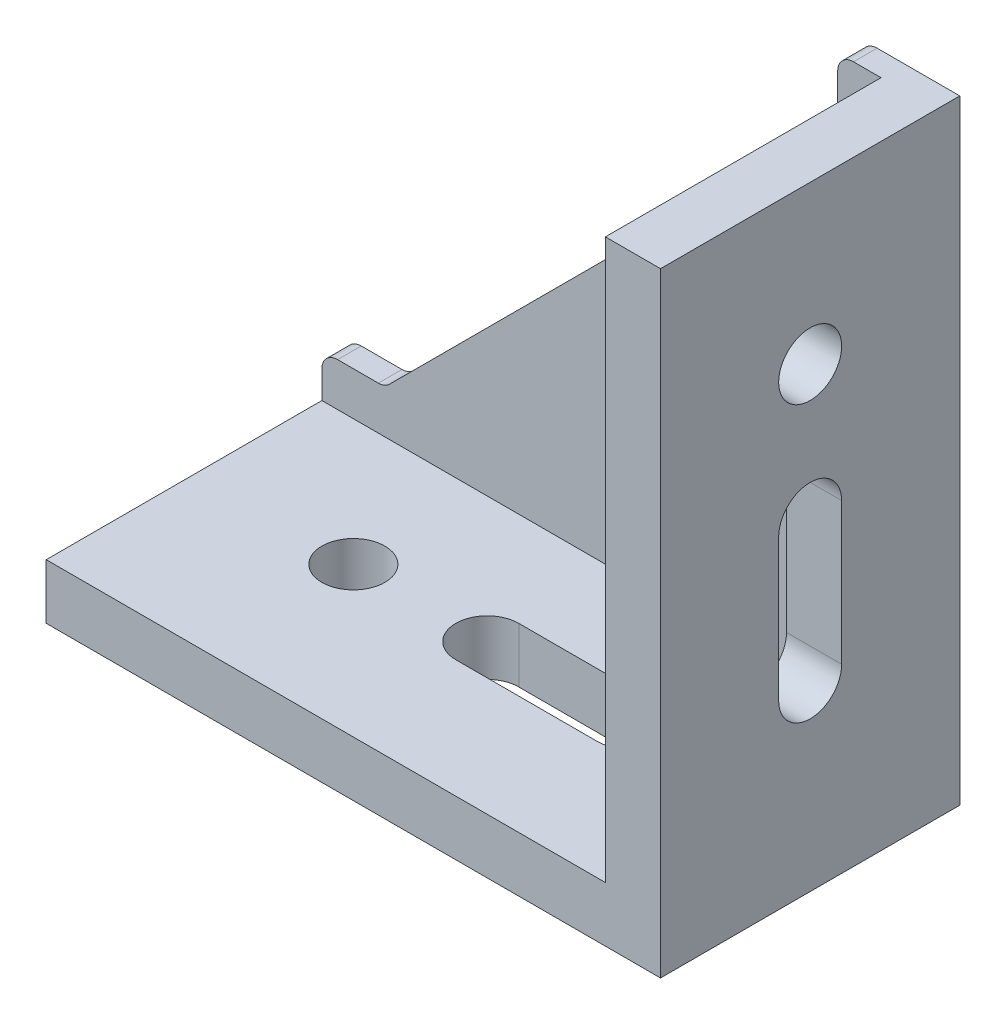
ISO-10303-21;
HEADER;
FILE_DESCRIPTION(('STEP AP214'),'2;1');
FILE_NAME('part.step','',(''),(''),'','','');
FILE_SCHEMA(('AUTOMOTIVE_DESIGN { 1 0 10303 214 1 1 1 1 }'));
ENDSEC;
DATA;
#1=APPLICATION_CONTEXT('core data for automotive mechanical design processes');
#2=APPLICATION_PROTOCOL_DEFINITION('international standard','automotive_design',2000,#1);
#3=PRODUCT_CONTEXT('',#1,'mechanical');
#4=PRODUCT('Part','Part','',(#3));
#5=PRODUCT_RELATED_PRODUCT_CATEGORY('part','',(#4));
#6=PRODUCT_DEFINITION_FORMATION('','',#4);
#7=PRODUCT_DEFINITION_CONTEXT('part definition',#1,'design');
#8=PRODUCT_DEFINITION('design','',#6,#7);
#9=PRODUCT_DEFINITION_SHAPE('','',#8);
#10=(LENGTH_UNIT() NAMED_UNIT(*) SI_UNIT(.MILLI.,.METRE.));
#11=(NAMED_UNIT(*) PLANE_ANGLE_UNIT() SI_UNIT($,.RADIAN.));
#12=(NAMED_UNIT(*) SI_UNIT($,.STERADIAN.) SOLID_ANGLE_UNIT());
#13=UNCERTAINTY_MEASURE_WITH_UNIT(LENGTH_MEASURE(1.E-05),#10,'distance_accuracy_value','');
#14=(GEOMETRIC_REPRESENTATION_CONTEXT(3) GLOBAL_UNCERTAINTY_ASSIGNED_CONTEXT((#13)) GLOBAL_UNIT_ASSIGNED_CONTEXT((#10,
#11,#12)) REPRESENTATION_CONTEXT('',''));
#15=CARTESIAN_POINT('',(0.,0.,0.));
#16=DIRECTION('',(0.,0.,1.));
#17=DIRECTION('',(1.,0.,0.));
#18=AXIS2_PLACEMENT_3D('',#15,#16,#17);
#19=CARTESIAN_POINT('',(0.,0.,35.));
#20=DIRECTION('',(1.,0.,0.));
#21=DIRECTION('',(0.,0.,-1.));
#22=AXIS2_PLACEMENT_3D('',#19,#20,#21);
#23=PLANE('',#22);
#24=DIRECTION('',(0.,1.,0.));
#25=VECTOR('',#24,1.);
#26=CARTESIAN_POINT('',(0.,12.5,0.));
#27=LINE('',#26,#25);
#28=CARTESIAN_POINT('',(0.,7.,0.));
#29=VERTEX_POINT('',#28);
#30=CARTESIAN_POINT('',(0.,10.5,0.));
#31=VERTEX_POINT('',#30);
#32=EDGE_CURVE('E292',#29,#31,#27,.T.);
#33=ORIENTED_EDGE('',*,*,#32,.T.);
#34=DIRECTION('',(0.,0.,1.));
#35=VECTOR('',#34,1.);
#36=CARTESIAN_POINT('',(0.,10.5,35.));
#37=LINE('',#36,#35);
#38=CARTESIAN_POINT('',(0.,10.5,-3.));
#39=VERTEX_POINT('',#38);
#40=EDGE_CURVE('E344',#31,#39,#37,.F.);
#41=ORIENTED_EDGE('',*,*,#40,.T.);
#42=DIRECTION('',(0.,1.,0.));
#43=VECTOR('',#42,1.);
#44=CARTESIAN_POINT('',(0.,12.5,-3.));
#45=LINE('',#44,#43);
#46=CARTESIAN_POINT('',(0.,0.,-3.));
#47=VERTEX_POINT('',#46);
#48=EDGE_CURVE('E280',#47,#39,#45,.T.);
#49=ORIENTED_EDGE('',*,*,#48,.F.);
#50=DIRECTION('',(0.,0.,-1.));
#51=VECTOR('',#50,1.);
#52=CARTESIAN_POINT('',(0.,0.,35.));
#53=LINE('',#52,#51);
#54=CARTESIAN_POINT('',(0.,0.,35.));
#55=VERTEX_POINT('',#54);
#56=EDGE_CURVE('E334',#55,#47,#53,.T.);
#57=ORIENTED_EDGE('',*,*,#56,.F.);
#58=DIRECTION('',(0.,-1.,0.));
#59=VECTOR('',#58,1.);
#60=CARTESIAN_POINT('',(0.,0.,35.));
#61=LINE('',#60,#59);
#62=CARTESIAN_POINT('',(0.,7.,35.));
#63=VERTEX_POINT('',#62);
#64=EDGE_CURVE('E302',#63,#55,#61,.T.);
#65=ORIENTED_EDGE('',*,*,#64,.F.);
#66=DIRECTION('',(0.,0.,-1.));
#67=VECTOR('',#66,1.);
#68=CARTESIAN_POINT('',(0.,7.,35.));
#69=LINE('',#68,#67);
#70=EDGE_CURVE('E316',#63,#29,#69,.T.);
#71=ORIENTED_EDGE('',*,*,#70,.T.);
#72=EDGE_LOOP('',(#33,#41,#49,#57,#65,#71));
#73=FACE_BOUND('',#72,.T.);
#74=ADVANCED_FACE('F37',(#73),#23,.F.);
#75=CARTESIAN_POINT('',(0.,0.,35.));
#76=DIRECTION('',(0.,1.,0.));
#77=DIRECTION('',(0.,0.,1.));
#78=AXIS2_PLACEMENT_3D('',#75,#76,#77);
#79=PLANE('',#78);
#80=CARTESIAN_POINT('',(20.,0.,16.));
#81=DIRECTION('',(0.,1.,0.));
#82=DIRECTION('',(0.,0.,1.));
#83=AXIS2_PLACEMENT_3D('',#80,#81,#82);
#84=CIRCLE('',#83,4.00000000000001);
#85=CARTESIAN_POINT('',(20.,0.,20.));
#86=VERTEX_POINT('',#85);
#87=EDGE_CURVE('E270',#86,#86,#84,.T.);
#88=ORIENTED_EDGE('',*,*,#87,.T.);
#89=EDGE_LOOP('',(#88));
#90=FACE_BOUND('',#89,.T.);
#91=DIRECTION('',(-1.,0.,0.));
#92=VECTOR('',#91,1.);
#93=CARTESIAN_POINT('',(37.,0.,12.));
#94=LINE('',#93,#92);
#95=CARTESIAN_POINT('',(55.,0.,12.));
#96=VERTEX_POINT('',#95);
#97=CARTESIAN_POINT('',(37.,0.,12.));
#98=VERTEX_POINT('',#97);
#99=EDGE_CURVE('E197',#96,#98,#94,.T.);
#100=ORIENTED_EDGE('',*,*,#99,.T.);
#101=CARTESIAN_POINT('',(37.,0.,16.));
#102=DIRECTION('',(0.,1.,0.));
#103=DIRECTION('',(0.,0.,1.));
#104=AXIS2_PLACEMENT_3D('',#101,#102,#103);
#105=CIRCLE('',#104,4.);
#106=CARTESIAN_POINT('',(37.,0.,20.));
#107=VERTEX_POINT('',#106);
#108=EDGE_CURVE('E189',#98,#107,#105,.T.);
#109=ORIENTED_EDGE('',*,*,#108,.T.);
#110=DIRECTION('',(1.,0.,0.));
#111=VECTOR('',#110,1.);
#112=CARTESIAN_POINT('',(37.,0.,20.));
#113=LINE('',#112,#111);
#114=CARTESIAN_POINT('',(55.,0.,20.));
#115=VERTEX_POINT('',#114);
#116=EDGE_CURVE('E201',#107,#115,#113,.T.);
#117=ORIENTED_EDGE('',*,*,#116,.T.);
#118=CARTESIAN_POINT('',(55.,0.,16.));
#119=DIRECTION('',(0.,1.,0.));
#120=DIRECTION('',(0.,0.,1.));
#121=AXIS2_PLACEMENT_3D('',#118,#119,#120);
#122=CIRCLE('',#121,4.);
#123=EDGE_CURVE('E205',#115,#96,#122,.T.);
#124=ORIENTED_EDGE('',*,*,#123,.T.);
#125=EDGE_LOOP('',(#100,#109,#117,#124));
#126=FACE_BOUND('',#125,.T.);
#127=ORIENTED_EDGE('',*,*,#56,.T.);
#128=DIRECTION('',(-1.,0.,0.));
#129=VECTOR('',#128,1.);
#130=CARTESIAN_POINT('',(78.,0.,-3.));
#131=LINE('',#130,#129);
#132=CARTESIAN_POINT('',(78.,0.,-3.));
#133=VERTEX_POINT('',#132);
#134=EDGE_CURVE('E277',#133,#47,#131,.T.);
#135=ORIENTED_EDGE('',*,*,#134,.F.);
#136=DIRECTION('',(0.,0.,-1.));
#137=VECTOR('',#136,1.);
#138=CARTESIAN_POINT('',(78.,0.,35.));
#139=LINE('',#138,#137);
#140=CARTESIAN_POINT('',(78.,0.,35.));
#141=VERTEX_POINT('',#140);
#142=EDGE_CURVE('E332',#141,#133,#139,.T.);
#143=ORIENTED_EDGE('',*,*,#142,.F.);
#144=DIRECTION('',(1.,0.,0.));
#145=VECTOR('',#144,1.);
#146=CARTESIAN_POINT('',(0.,0.,35.));
#147=LINE('',#146,#145);
#148=EDGE_CURVE('E305',#55,#141,#147,.T.);
#149=ORIENTED_EDGE('',*,*,#148,.F.);
#150=EDGE_LOOP('',(#127,#135,#143,#149));
#151=FACE_BOUND('',#150,.T.);
#152=ADVANCED_FACE('F207',(#90,#126,#151),#79,.F.);
#153=CARTESIAN_POINT('',(78.,0.,35.));
#154=DIRECTION('',(-1.,0.,0.));
#155=DIRECTION('',(0.,0.,1.));
#156=AXIS2_PLACEMENT_3D('',#153,#154,#155);
#157=PLANE('',#156);
#158=DIRECTION('',(0.,1.,0.));
#159=VECTOR('',#158,1.);
#160=CARTESIAN_POINT('',(78.,41.,20.));
#161=LINE('',#160,#159);
#162=CARTESIAN_POINT('',(78.,23.,20.));
#163=VERTEX_POINT('',#162);
#164=CARTESIAN_POINT('',(78.,41.,20.));
#165=VERTEX_POINT('',#164);
#166=EDGE_CURVE('E241',#163,#165,#161,.T.);
#167=ORIENTED_EDGE('',*,*,#166,.T.);
#168=CARTESIAN_POINT('',(78.,41.,16.));
#169=DIRECTION('',(-1.,0.,0.));
#170=DIRECTION('',(0.,0.,1.));
#171=AXIS2_PLACEMENT_3D('',#168,#169,#170);
#172=CIRCLE('',#171,4.);
#173=CARTESIAN_POINT('',(78.,41.,12.));
#174=VERTEX_POINT('',#173);
#175=EDGE_CURVE('E231',#165,#174,#172,.T.);
#176=ORIENTED_EDGE('',*,*,#175,.T.);
#177=DIRECTION('',(0.,-1.,0.));
#178=VECTOR('',#177,1.);
#179=CARTESIAN_POINT('',(78.,41.,12.));
#180=LINE('',#179,#178);
#181=CARTESIAN_POINT('',(78.,23.,12.));
#182=VERTEX_POINT('',#181);
#183=EDGE_CURVE('E234',#174,#182,#180,.T.);
#184=ORIENTED_EDGE('',*,*,#183,.T.);
#185=CARTESIAN_POINT('',(78.,23.,16.));
#186=DIRECTION('',(-1.,0.,0.));
#187=DIRECTION('',(0.,0.,1.));
#188=AXIS2_PLACEMENT_3D('',#185,#186,#187);
#189=CIRCLE('',#188,4.);
#190=EDGE_CURVE('E238',#182,#163,#189,.T.);
#191=ORIENTED_EDGE('',*,*,#190,.T.);
#192=EDGE_LOOP('',(#167,#176,#184,#191));
#193=FACE_BOUND('',#192,.T.);
#194=CARTESIAN_POINT('',(78.,58.,16.));
#195=DIRECTION('',(-1.,0.,0.));
#196=DIRECTION('',(0.,0.,1.));
#197=AXIS2_PLACEMENT_3D('',#194,#195,#196);
#198=CIRCLE('',#197,4.);
#199=CARTESIAN_POINT('',(78.,58.,20.));
#200=VERTEX_POINT('',#199);
#201=EDGE_CURVE('E248',#200,#200,#198,.T.);
#202=ORIENTED_EDGE('',*,*,#201,.T.);
#203=EDGE_LOOP('',(#202));
#204=FACE_BOUND('',#203,.T.);
#205=ORIENTED_EDGE('',*,*,#142,.T.);
#206=DIRECTION('',(0.,-1.,0.));
#207=VECTOR('',#206,1.);
#208=CARTESIAN_POINT('',(78.,78.,-3.));
#209=LINE('',#208,#207);
#210=CARTESIAN_POINT('',(78.,78.,-3.));
#211=VERTEX_POINT('',#210);
#212=EDGE_CURVE('E273',#211,#133,#209,.T.);
#213=ORIENTED_EDGE('',*,*,#212,.F.);
#214=DIRECTION('',(0.,0.,-1.));
#215=VECTOR('',#214,1.);
#216=CARTESIAN_POINT('',(78.,78.,35.));
#217=LINE('',#216,#215);
#218=CARTESIAN_POINT('',(78.,78.,35.));
#219=VERTEX_POINT('',#218);
#220=EDGE_CURVE('E329',#219,#211,#217,.T.);
#221=ORIENTED_EDGE('',*,*,#220,.F.);
#222=DIRECTION('',(0.,1.,0.));
#223=VECTOR('',#222,1.);
#224=CARTESIAN_POINT('',(78.,0.,35.));
#225=LINE('',#224,#223);
#226=EDGE_CURVE('E308',#141,#219,#225,.T.);
#227=ORIENTED_EDGE('',*,*,#226,.F.);
#228=EDGE_LOOP('',(#205,#213,#221,#227));
#229=FACE_BOUND('',#228,.T.);
#230=ADVANCED_FACE('F405',(#193,#204,#229),#157,.F.);
#231=CARTESIAN_POINT('',(71.,78.,35.));
#232=DIRECTION('',(0.,-1.,0.));
#233=DIRECTION('',(0.,0.,-1.));
#234=AXIS2_PLACEMENT_3D('',#231,#232,#233);
#235=PLANE('',#234);
#236=DIRECTION('',(1.,0.,0.));
#237=VECTOR('',#236,1.);
#238=CARTESIAN_POINT('',(78.,78.,-3.));
#239=LINE('',#238,#237);
#240=CARTESIAN_POINT('',(67.5,78.,-3.));
#241=VERTEX_POINT('',#240);
#242=EDGE_CURVE('E271',#241,#211,#239,.T.);
#243=ORIENTED_EDGE('',*,*,#242,.F.);
#244=DIRECTION('',(0.,0.,1.));
#245=VECTOR('',#244,1.);
#246=CARTESIAN_POINT('',(67.5,78.,35.));
#247=LINE('',#246,#245);
#248=CARTESIAN_POINT('',(67.5,78.,0.));
#249=VERTEX_POINT('',#248);
#250=EDGE_CURVE('E350',#241,#249,#247,.T.);
#251=ORIENTED_EDGE('',*,*,#250,.T.);
#252=DIRECTION('',(1.,0.,0.));
#253=VECTOR('',#252,1.);
#254=CARTESIAN_POINT('',(78.,78.,0.));
#255=LINE('',#254,#253);
#256=CARTESIAN_POINT('',(71.,78.,0.));
#257=VERTEX_POINT('',#256);
#258=EDGE_CURVE('E258',#249,#257,#255,.T.);
#259=ORIENTED_EDGE('',*,*,#258,.T.);
#260=DIRECTION('',(0.,0.,-1.));
#261=VECTOR('',#260,1.);
#262=CARTESIAN_POINT('',(71.,78.,35.));
#263=LINE('',#262,#261);
#264=CARTESIAN_POINT('',(71.,78.,35.));
#265=VERTEX_POINT('',#264);
#266=EDGE_CURVE('E326',#265,#257,#263,.T.);
#267=ORIENTED_EDGE('',*,*,#266,.F.);
#268=DIRECTION('',(-1.,0.,0.));
#269=VECTOR('',#268,1.);
#270=CARTESIAN_POINT('',(71.,78.,35.));
#271=LINE('',#270,#269);
#272=EDGE_CURVE('E310',#219,#265,#271,.T.);
#273=ORIENTED_EDGE('',*,*,#272,.F.);
#274=ORIENTED_EDGE('',*,*,#220,.T.);
#275=EDGE_LOOP('',(#243,#251,#259,#267,#273,#274));
#276=FACE_BOUND('',#275,.T.);
#277=ADVANCED_FACE('F386',(#276),#235,.F.);
#278=CARTESIAN_POINT('',(71.,7.,35.));
#279=DIRECTION('',(1.,0.,0.));
#280=DIRECTION('',(0.,0.,-1.));
#281=AXIS2_PLACEMENT_3D('',#278,#279,#280);
#282=PLANE('',#281);
#283=DIRECTION('',(0.,-1.,0.));
#284=VECTOR('',#283,1.);
#285=CARTESIAN_POINT('',(71.,41.,12.));
#286=LINE('',#285,#284);
#287=CARTESIAN_POINT('',(71.,41.,12.));
#288=VERTEX_POINT('',#287);
#289=CARTESIAN_POINT('',(71.,23.,12.));
#290=VERTEX_POINT('',#289);
#291=EDGE_CURVE('E247',#288,#290,#286,.T.);
#292=ORIENTED_EDGE('',*,*,#291,.F.);
#293=CARTESIAN_POINT('',(71.,41.,16.));
#294=DIRECTION('',(-1.,0.,0.));
#295=DIRECTION('',(0.,0.,1.));
#296=AXIS2_PLACEMENT_3D('',#293,#294,#295);
#297=CIRCLE('',#296,4.);
#298=CARTESIAN_POINT('',(71.,41.,20.));
#299=VERTEX_POINT('',#298);
#300=EDGE_CURVE('E245',#299,#288,#297,.T.);
#301=ORIENTED_EDGE('',*,*,#300,.F.);
#302=DIRECTION('',(0.,1.,0.));
#303=VECTOR('',#302,1.);
#304=CARTESIAN_POINT('',(71.,41.,20.));
#305=LINE('',#304,#303);
#306=CARTESIAN_POINT('',(71.,23.,20.));
#307=VERTEX_POINT('',#306);
#308=EDGE_CURVE('E235',#307,#299,#305,.T.);
#309=ORIENTED_EDGE('',*,*,#308,.F.);
#310=CARTESIAN_POINT('',(71.,23.,16.));
#311=DIRECTION('',(-1.,0.,0.));
#312=DIRECTION('',(0.,0.,1.));
#313=AXIS2_PLACEMENT_3D('',#310,#311,#312);
#314=CIRCLE('',#313,4.);
#315=EDGE_CURVE('E251',#290,#307,#314,.T.);
#316=ORIENTED_EDGE('',*,*,#315,.F.);
#317=EDGE_LOOP('',(#292,#301,#309,#316));
#318=FACE_BOUND('',#317,.T.);
#319=CARTESIAN_POINT('',(71.,58.,16.));
#320=DIRECTION('',(-1.,0.,0.));
#321=DIRECTION('',(0.,0.,1.));
#322=AXIS2_PLACEMENT_3D('',#319,#320,#321);
#323=CIRCLE('',#322,4.);
#324=CARTESIAN_POINT('',(71.,58.,20.));
#325=VERTEX_POINT('',#324);
#326=EDGE_CURVE('E267',#325,#325,#323,.T.);
#327=ORIENTED_EDGE('',*,*,#326,.F.);
#328=EDGE_LOOP('',(#327));
#329=FACE_BOUND('',#328,.T.);
#330=DIRECTION('',(0.,-1.,0.));
#331=VECTOR('',#330,1.);
#332=CARTESIAN_POINT('',(71.,7.,0.));
#333=LINE('',#332,#331);
#334=CARTESIAN_POINT('',(71.,7.,0.));
#335=VERTEX_POINT('',#334);
#336=EDGE_CURVE('E290',#257,#335,#333,.T.);
#337=ORIENTED_EDGE('',*,*,#336,.T.);
#338=DIRECTION('',(0.,0.,-1.));
#339=VECTOR('',#338,1.);
#340=CARTESIAN_POINT('',(71.,7.,35.));
#341=LINE('',#340,#339);
#342=CARTESIAN_POINT('',(71.,7.,35.));
#343=VERTEX_POINT('',#342);
#344=EDGE_CURVE('E323',#343,#335,#341,.T.);
#345=ORIENTED_EDGE('',*,*,#344,.F.);
#346=DIRECTION('',(0.,-1.,0.));
#347=VECTOR('',#346,1.);
#348=CARTESIAN_POINT('',(71.,7.,35.));
#349=LINE('',#348,#347);
#350=EDGE_CURVE('E312',#265,#343,#349,.T.);
#351=ORIENTED_EDGE('',*,*,#350,.F.);
#352=ORIENTED_EDGE('',*,*,#266,.T.);
#353=EDGE_LOOP('',(#337,#345,#351,#352));
#354=FACE_BOUND('',#353,.T.);
#355=ADVANCED_FACE('F397',(#318,#329,#354),#282,.F.);
#356=CARTESIAN_POINT('',(0.,7.,35.));
#357=DIRECTION('',(0.,-1.,0.));
#358=DIRECTION('',(0.,0.,-1.));
#359=AXIS2_PLACEMENT_3D('',#356,#357,#358);
#360=PLANE('',#359);
#361=CARTESIAN_POINT('',(20.,7.,16.));
#362=DIRECTION('',(0.,1.,0.));
#363=DIRECTION('',(0.,0.,1.));
#364=AXIS2_PLACEMENT_3D('',#361,#362,#363);
#365=CIRCLE('',#364,4.00000000000001);
#366=CARTESIAN_POINT('',(20.,7.,20.));
#367=VERTEX_POINT('',#366);
#368=EDGE_CURVE('E216',#367,#367,#365,.T.);
#369=ORIENTED_EDGE('',*,*,#368,.F.);
#370=EDGE_LOOP('',(#369));
#371=FACE_BOUND('',#370,.T.);
#372=DIRECTION('',(1.,0.,0.));
#373=VECTOR('',#372,1.);
#374=CARTESIAN_POINT('',(37.,7.,20.));
#375=LINE('',#374,#373);
#376=CARTESIAN_POINT('',(37.,7.,20.));
#377=VERTEX_POINT('',#376);
#378=CARTESIAN_POINT('',(55.,7.,20.));
#379=VERTEX_POINT('',#378);
#380=EDGE_CURVE('E222',#377,#379,#375,.T.);
#381=ORIENTED_EDGE('',*,*,#380,.F.);
#382=CARTESIAN_POINT('',(37.,7.,16.));
#383=DIRECTION('',(0.,1.,0.));
#384=DIRECTION('',(0.,0.,1.));
#385=AXIS2_PLACEMENT_3D('',#382,#383,#384);
#386=CIRCLE('',#385,4.);
#387=CARTESIAN_POINT('',(37.,7.,12.));
#388=VERTEX_POINT('',#387);
#389=EDGE_CURVE('E192',#388,#377,#386,.T.);
#390=ORIENTED_EDGE('',*,*,#389,.F.);
#391=DIRECTION('',(-1.,0.,0.));
#392=VECTOR('',#391,1.);
#393=CARTESIAN_POINT('',(37.,7.,12.));
#394=LINE('',#393,#392);
#395=CARTESIAN_POINT('',(55.,7.,12.));
#396=VERTEX_POINT('',#395);
#397=EDGE_CURVE('E210',#396,#388,#394,.T.);
#398=ORIENTED_EDGE('',*,*,#397,.F.);
#399=CARTESIAN_POINT('',(55.,7.,16.));
#400=DIRECTION('',(0.,1.,0.));
#401=DIRECTION('',(0.,0.,1.));
#402=AXIS2_PLACEMENT_3D('',#399,#400,#401);
#403=CIRCLE('',#402,4.);
#404=EDGE_CURVE('E213',#379,#396,#403,.T.);
#405=ORIENTED_EDGE('',*,*,#404,.F.);
#406=EDGE_LOOP('',(#381,#390,#398,#405));
#407=FACE_BOUND('',#406,.T.);
#408=DIRECTION('',(-1.,0.,0.));
#409=VECTOR('',#408,1.);
#410=CARTESIAN_POINT('',(0.,7.,0.));
#411=LINE('',#410,#409);
#412=EDGE_CURVE('E306',#335,#29,#411,.T.);
#413=ORIENTED_EDGE('',*,*,#412,.T.);
#414=ORIENTED_EDGE('',*,*,#70,.F.);
#415=DIRECTION('',(-1.,0.,0.));
#416=VECTOR('',#415,1.);
#417=CARTESIAN_POINT('',(0.,7.,35.));
#418=LINE('',#417,#416);
#419=EDGE_CURVE('E314',#343,#63,#418,.T.);
#420=ORIENTED_EDGE('',*,*,#419,.F.);
#421=ORIENTED_EDGE('',*,*,#344,.T.);
#422=EDGE_LOOP('',(#413,#414,#420,#421));
#423=FACE_BOUND('',#422,.T.);
#424=ADVANCED_FACE('F494',(#371,#407,#423),#360,.F.);
#425=CARTESIAN_POINT('',(0.,0.,35.));
#426=DIRECTION('',(0.,0.,-1.));
#427=DIRECTION('',(-1.,0.,0.));
#428=AXIS2_PLACEMENT_3D('',#425,#426,#427);
#429=PLANE('',#428);
#430=ORIENTED_EDGE('',*,*,#64,.T.);
#431=ORIENTED_EDGE('',*,*,#148,.T.);
#432=ORIENTED_EDGE('',*,*,#226,.T.);
#433=ORIENTED_EDGE('',*,*,#272,.T.);
#434=ORIENTED_EDGE('',*,*,#350,.T.);
#435=ORIENTED_EDGE('',*,*,#419,.T.);
#436=EDGE_LOOP('',(#430,#431,#432,#433,#434,#435));
#437=FACE_BOUND('',#436,.T.);
#438=ADVANCED_FACE('F400',(#437),#429,.F.);
#439=CARTESIAN_POINT('',(0.,0.,0.));
#440=DIRECTION('',(0.,0.,1.));
#441=DIRECTION('',(1.,0.,0.));
#442=AXIS2_PLACEMENT_3D('',#439,#440,#441);
#443=PLANE('',#442);
#444=DIRECTION('',(1.,0.,0.));
#445=VECTOR('',#444,1.);
#446=CARTESIAN_POINT('',(8.,12.5,0.));
#447=LINE('',#446,#445);
#448=CARTESIAN_POINT('',(2.,12.5,0.));
#449=VERTEX_POINT('',#448);
#450=CARTESIAN_POINT('',(7.17157287525382,12.5,0.));
#451=VERTEX_POINT('',#450);
#452=EDGE_CURVE('E295',#449,#451,#447,.T.);
#453=ORIENTED_EDGE('',*,*,#452,.F.);
#454=CARTESIAN_POINT('',(2.,10.5,0.));
#455=DIRECTION('',(0.,0.,1.));
#456=DIRECTION('',(1.,0.,0.));
#457=AXIS2_PLACEMENT_3D('',#454,#455,#456);
#458=CIRCLE('',#457,2.);
#459=EDGE_CURVE('E342',#449,#31,#458,.T.);
#460=ORIENTED_EDGE('',*,*,#459,.T.);
#461=ORIENTED_EDGE('',*,*,#32,.F.);
#462=ORIENTED_EDGE('',*,*,#412,.F.);
#463=ORIENTED_EDGE('',*,*,#336,.F.);
#464=ORIENTED_EDGE('',*,*,#258,.F.);
#465=CARTESIAN_POINT('',(67.5,76.,0.));
#466=DIRECTION('',(0.,0.,1.));
#467=DIRECTION('',(1.,0.,0.));
#468=AXIS2_PLACEMENT_3D('',#465,#466,#467);
#469=CIRCLE('',#468,2.);
#470=CARTESIAN_POINT('',(65.5,76.,0.));
#471=VERTEX_POINT('',#470);
#472=EDGE_CURVE('E339',#249,#471,#469,.T.);
#473=ORIENTED_EDGE('',*,*,#472,.T.);
#474=DIRECTION('',(0.,1.,0.));
#475=VECTOR('',#474,1.);
#476=CARTESIAN_POINT('',(65.5,78.,0.));
#477=LINE('',#476,#475);
#478=CARTESIAN_POINT('',(65.5,70.8284271247462,0.));
#479=VERTEX_POINT('',#478);
#480=EDGE_CURVE('E274',#479,#471,#477,.T.);
#481=ORIENTED_EDGE('',*,*,#480,.F.);
#482=CARTESIAN_POINT('',(63.5,70.8284271247462,0.));
#483=DIRECTION('',(0.,0.,1.));
#484=DIRECTION('',(1.,0.,0.));
#485=AXIS2_PLACEMENT_3D('',#482,#483,#484);
#486=CIRCLE('',#485,2.);
#487=CARTESIAN_POINT('',(64.9142135623731,69.4142135623731,0.));
#488=VERTEX_POINT('',#487);
#489=EDGE_CURVE('E45',#479,#488,#486,.F.);
#490=ORIENTED_EDGE('',*,*,#489,.T.);
#491=DIRECTION('',(0.707106781186548,0.707106781186548,0.));
#492=VECTOR('',#491,1.);
#493=CARTESIAN_POINT('',(65.5,70.,0.));
#494=LINE('',#493,#492);
#495=CARTESIAN_POINT('',(8.5857864376269,13.0857864376269,0.));
#496=VERTEX_POINT('',#495);
#497=EDGE_CURVE('E298',#496,#488,#494,.T.);
#498=ORIENTED_EDGE('',*,*,#497,.F.);
#499=CARTESIAN_POINT('',(7.17157287525382,14.5,0.));
#500=DIRECTION('',(0.,0.,1.));
#501=DIRECTION('',(1.,0.,0.));
#502=AXIS2_PLACEMENT_3D('',#499,#500,#501);
#503=CIRCLE('',#502,2.);
#504=EDGE_CURVE('E365',#496,#451,#503,.F.);
#505=ORIENTED_EDGE('',*,*,#504,.T.);
#506=EDGE_LOOP('',(#453,#460,#461,#462,#463,#464,#473,#481,#490,#498,#505));
#507=FACE_BOUND('',#506,.T.);
#508=ADVANCED_FACE('F372',(#507),#443,.T.);
#509=CARTESIAN_POINT('',(8.,12.5,-3.));
#510=DIRECTION('',(0.,-1.,0.));
#511=DIRECTION('',(0.,0.,-1.));
#512=AXIS2_PLACEMENT_3D('',#509,#510,#511);
#513=PLANE('',#512);
#514=ORIENTED_EDGE('',*,*,#452,.T.);
#515=DIRECTION('',(0.,0.,1.));
#516=VECTOR('',#515,1.);
#517=CARTESIAN_POINT('',(7.17157287525382,12.5,-3.));
#518=LINE('',#517,#516);
#519=CARTESIAN_POINT('',(7.17157287525382,12.5,-3.));
#520=VERTEX_POINT('',#519);
#521=EDGE_CURVE('E361',#451,#520,#518,.F.);
#522=ORIENTED_EDGE('',*,*,#521,.T.);
#523=DIRECTION('',(1.,0.,0.));
#524=VECTOR('',#523,1.);
#525=CARTESIAN_POINT('',(8.,12.5,-3.));
#526=LINE('',#525,#524);
#527=CARTESIAN_POINT('',(2.,12.5,-3.));
#528=VERTEX_POINT('',#527);
#529=EDGE_CURVE('E283',#528,#520,#526,.T.);
#530=ORIENTED_EDGE('',*,*,#529,.F.);
#531=DIRECTION('',(0.,0.,1.));
#532=VECTOR('',#531,1.);
#533=CARTESIAN_POINT('',(2.,12.5,-3.));
#534=LINE('',#533,#532);
#535=EDGE_CURVE('E336',#528,#449,#534,.T.);
#536=ORIENTED_EDGE('',*,*,#535,.T.);
#537=EDGE_LOOP('',(#514,#522,#530,#536));
#538=FACE_BOUND('',#537,.T.);
#539=ADVANCED_FACE('F418',(#538),#513,.F.);
#540=CARTESIAN_POINT('',(65.5,70.,-3.));
#541=DIRECTION('',(0.707106781186548,-0.707106781186547,0.));
#542=DIRECTION('',(0.707106781186547,0.707106781186548,0.));
#543=AXIS2_PLACEMENT_3D('',#540,#541,#542);
#544=PLANE('',#543);
#545=DIRECTION('',(0.707106781186548,0.707106781186548,0.));
#546=VECTOR('',#545,1.);
#547=CARTESIAN_POINT('',(65.5,70.,-3.));
#548=LINE('',#547,#546);
#549=CARTESIAN_POINT('',(8.5857864376269,13.0857864376269,-3.));
#550=VERTEX_POINT('',#549);
#551=CARTESIAN_POINT('',(64.9142135623731,69.4142135623731,-3.));
#552=VERTEX_POINT('',#551);
#553=EDGE_CURVE('E286',#550,#552,#548,.T.);
#554=ORIENTED_EDGE('',*,*,#553,.F.);
#555=DIRECTION('',(0.,0.,1.));
#556=VECTOR('',#555,1.);
#557=CARTESIAN_POINT('',(8.58578643762691,13.0857864376269,0.));
#558=LINE('',#557,#556);
#559=EDGE_CURVE('E358',#550,#496,#558,.T.);
#560=ORIENTED_EDGE('',*,*,#559,.T.);
#561=ORIENTED_EDGE('',*,*,#497,.T.);
#562=DIRECTION('',(0.,0.,1.));
#563=VECTOR('',#562,1.);
#564=CARTESIAN_POINT('',(64.9142135623731,69.4142135623731,-3.));
#565=LINE('',#564,#563);
#566=EDGE_CURVE('E356',#488,#552,#565,.F.);
#567=ORIENTED_EDGE('',*,*,#566,.T.);
#568=EDGE_LOOP('',(#554,#560,#561,#567));
#569=FACE_BOUND('',#568,.T.);
#570=ADVANCED_FACE('F375',(#569),#544,.F.);
#571=CARTESIAN_POINT('',(65.5,78.,-3.));
#572=DIRECTION('',(1.,0.,0.));
#573=DIRECTION('',(0.,0.,-1.));
#574=AXIS2_PLACEMENT_3D('',#571,#572,#573);
#575=PLANE('',#574);
#576=DIRECTION('',(0.,1.,0.));
#577=VECTOR('',#576,1.);
#578=CARTESIAN_POINT('',(65.5,78.,-3.));
#579=LINE('',#578,#577);
#580=CARTESIAN_POINT('',(65.5,70.8284271247462,-3.));
#581=VERTEX_POINT('',#580);
#582=CARTESIAN_POINT('',(65.5,76.,-3.));
#583=VERTEX_POINT('',#582);
#584=EDGE_CURVE('E288',#581,#583,#579,.T.);
#585=ORIENTED_EDGE('',*,*,#584,.F.);
#586=DIRECTION('',(0.,0.,1.));
#587=VECTOR('',#586,1.);
#588=CARTESIAN_POINT('',(65.5,70.8284271247462,0.));
#589=LINE('',#588,#587);
#590=EDGE_CURVE('E363',#581,#479,#589,.T.);
#591=ORIENTED_EDGE('',*,*,#590,.T.);
#592=ORIENTED_EDGE('',*,*,#480,.T.);
#593=DIRECTION('',(0.,0.,1.));
#594=VECTOR('',#593,1.);
#595=CARTESIAN_POINT('',(65.5,76.,-3.));
#596=LINE('',#595,#594);
#597=EDGE_CURVE('E353',#471,#583,#596,.F.);
#598=ORIENTED_EDGE('',*,*,#597,.T.);
#599=EDGE_LOOP('',(#585,#591,#592,#598));
#600=FACE_BOUND('',#599,.T.);
#601=ADVANCED_FACE('F378',(#600),#575,.F.);
#602=CARTESIAN_POINT('',(0.,0.,-3.));
#603=DIRECTION('',(0.,0.,1.));
#604=DIRECTION('',(1.,0.,0.));
#605=AXIS2_PLACEMENT_3D('',#602,#603,#604);
#606=PLANE('',#605);
#607=ORIENTED_EDGE('',*,*,#48,.T.);
#608=CARTESIAN_POINT('',(2.,10.5,-3.));
#609=DIRECTION('',(0.,0.,1.));
#610=DIRECTION('',(1.,0.,0.));
#611=AXIS2_PLACEMENT_3D('',#608,#609,#610);
#612=CIRCLE('',#611,2.);
#613=EDGE_CURVE('E348',#39,#528,#612,.F.);
#614=ORIENTED_EDGE('',*,*,#613,.T.);
#615=ORIENTED_EDGE('',*,*,#529,.T.);
#616=CARTESIAN_POINT('',(7.17157287525382,14.5,-3.));
#617=DIRECTION('',(0.,0.,1.));
#618=DIRECTION('',(1.,0.,0.));
#619=AXIS2_PLACEMENT_3D('',#616,#617,#618);
#620=CIRCLE('',#619,2.);
#621=EDGE_CURVE('E367',#520,#550,#620,.T.);
#622=ORIENTED_EDGE('',*,*,#621,.T.);
#623=ORIENTED_EDGE('',*,*,#553,.T.);
#624=CARTESIAN_POINT('',(63.5,70.8284271247462,-3.));
#625=DIRECTION('',(0.,0.,1.));
#626=DIRECTION('',(1.,0.,0.));
#627=AXIS2_PLACEMENT_3D('',#624,#625,#626);
#628=CIRCLE('',#627,2.);
#629=EDGE_CURVE('E11',#552,#581,#628,.T.);
#630=ORIENTED_EDGE('',*,*,#629,.T.);
#631=ORIENTED_EDGE('',*,*,#584,.T.);
#632=CARTESIAN_POINT('',(67.5,76.,-3.));
#633=DIRECTION('',(0.,0.,1.));
#634=DIRECTION('',(1.,0.,0.));
#635=AXIS2_PLACEMENT_3D('',#632,#633,#634);
#636=CIRCLE('',#635,2.);
#637=EDGE_CURVE('E346',#583,#241,#636,.F.);
#638=ORIENTED_EDGE('',*,*,#637,.T.);
#639=ORIENTED_EDGE('',*,*,#242,.T.);
#640=ORIENTED_EDGE('',*,*,#212,.T.);
#641=ORIENTED_EDGE('',*,*,#134,.T.);
#642=EDGE_LOOP('',(#607,#614,#615,#622,#623,#630,#631,#638,#639,#640,#641));
#643=FACE_BOUND('',#642,.T.);
#644=ADVANCED_FACE('F381',(#643),#606,.F.);
#645=CARTESIAN_POINT('',(78.,58.,16.));
#646=DIRECTION('',(-1.,0.,0.));
#647=DIRECTION('',(0.,0.,1.));
#648=AXIS2_PLACEMENT_3D('',#645,#646,#647);
#649=CYLINDRICAL_SURFACE('',#648,4.);
#650=CARTESIAN_POINT('',(78.,58.,20.));
#651=CARTESIAN_POINT('',(77.9270833333333,58.,20.));
#652=CARTESIAN_POINT('',(77.8541666666667,58.,20.));
#653=CARTESIAN_POINT('',(77.7083333333333,58.,20.));
#654=CARTESIAN_POINT('',(77.6354166666667,58.,20.));
#655=CARTESIAN_POINT('',(77.4895833333333,58.,20.));
#656=CARTESIAN_POINT('',(77.4166666666667,58.,20.));
#657=CARTESIAN_POINT('',(77.2708333333333,58.,20.));
#658=CARTESIAN_POINT('',(77.1979166666667,58.,20.));
#659=CARTESIAN_POINT('',(77.0520833333333,58.,20.));
#660=CARTESIAN_POINT('',(76.9791666666667,58.,20.));
#661=CARTESIAN_POINT('',(76.8333333333333,58.,20.));
#662=CARTESIAN_POINT('',(76.7604166666667,58.,20.));
#663=CARTESIAN_POINT('',(76.6145833333333,58.,20.));
#664=CARTESIAN_POINT('',(76.5416666666667,58.,20.));
#665=CARTESIAN_POINT('',(76.3958333333333,58.,20.));
#666=CARTESIAN_POINT('',(76.3229166666667,58.,20.));
#667=CARTESIAN_POINT('',(76.1770833333333,58.,20.));
#668=CARTESIAN_POINT('',(76.1041666666667,58.,20.));
#669=CARTESIAN_POINT('',(75.9583333333333,58.,20.));
#670=CARTESIAN_POINT('',(75.8854166666667,58.,20.));
#671=CARTESIAN_POINT('',(75.7395833333333,58.,20.));
#672=CARTESIAN_POINT('',(75.6666666666667,58.,20.));
#673=CARTESIAN_POINT('',(75.5208333333333,58.,20.));
#674=CARTESIAN_POINT('',(75.4479166666667,58.,20.));
#675=CARTESIAN_POINT('',(75.3020833333333,58.,20.));
#676=CARTESIAN_POINT('',(75.2291666666667,58.,20.));
#677=CARTESIAN_POINT('',(75.0833333333333,58.,20.));
#678=CARTESIAN_POINT('',(75.0104166666667,58.,20.));
#679=CARTESIAN_POINT('',(74.8645833333333,58.,20.));
#680=CARTESIAN_POINT('',(74.7916666666667,58.,20.));
#681=CARTESIAN_POINT('',(74.6458333333333,58.,20.));
#682=CARTESIAN_POINT('',(74.5729166666667,58.,20.));
#683=CARTESIAN_POINT('',(74.4270833333333,58.,20.));
#684=CARTESIAN_POINT('',(74.3541666666667,58.,20.));
#685=CARTESIAN_POINT('',(74.2083333333333,58.,20.));
#686=CARTESIAN_POINT('',(74.1354166666667,58.,20.));
#687=CARTESIAN_POINT('',(73.9895833333333,58.,20.));
#688=CARTESIAN_POINT('',(73.9166666666667,58.,20.));
#689=CARTESIAN_POINT('',(73.7708333333333,58.,20.));
#690=CARTESIAN_POINT('',(73.6979166666667,58.,20.));
#691=CARTESIAN_POINT('',(73.5520833333333,58.,20.));
#692=CARTESIAN_POINT('',(73.4791666666667,58.,20.));
#693=CARTESIAN_POINT('',(73.3333333333333,58.,20.));
#694=CARTESIAN_POINT('',(73.2604166666667,58.,20.));
#695=CARTESIAN_POINT('',(73.1145833333333,58.,20.));
#696=CARTESIAN_POINT('',(73.0416666666667,58.,20.));
#697=CARTESIAN_POINT('',(72.8958333333333,58.,20.));
#698=CARTESIAN_POINT('',(72.8229166666667,58.,20.));
#699=CARTESIAN_POINT('',(72.6770833333333,58.,20.));
#700=CARTESIAN_POINT('',(72.6041666666667,58.,20.));
#701=CARTESIAN_POINT('',(72.4583333333333,58.,20.));
#702=CARTESIAN_POINT('',(72.3854166666667,58.,20.));
#703=CARTESIAN_POINT('',(72.2395833333333,58.,20.));
#704=CARTESIAN_POINT('',(72.1666666666667,58.,20.));
#705=CARTESIAN_POINT('',(72.0208333333333,58.,20.));
#706=CARTESIAN_POINT('',(71.9479166666667,58.,20.));
#707=CARTESIAN_POINT('',(71.8020833333333,58.,20.));
#708=CARTESIAN_POINT('',(71.7291666666667,58.,20.));
#709=CARTESIAN_POINT('',(71.5833333333333,58.,20.));
#710=CARTESIAN_POINT('',(71.5104166666667,58.,20.));
#711=CARTESIAN_POINT('',(71.3645833333333,58.,20.));
#712=CARTESIAN_POINT('',(71.2916666666667,58.,20.));
#713=CARTESIAN_POINT('',(71.1458333333333,58.,20.));
#714=CARTESIAN_POINT('',(71.0729166666667,58.,20.));
#715=CARTESIAN_POINT('',(71.,58.,20.));
#716=B_SPLINE_CURVE_WITH_KNOTS('',3,(#650,#651,#652,#653,#654,#655,#656,#657,#658,#659,#660,
#661,#662,#663,#664,#665,#666,#667,#668,#669,#670,#671,#672,#673,#674,#675,#676,#677,#678,#679,
#680,#681,#682,#683,#684,#685,#686,#687,#688,#689,#690,#691,#692,#693,#694,#695,#696,#697,#698,
#699,#700,#701,#702,#703,#704,#705,#706,#707,#708,#709,#710,#711,#712,#713,#714,#715),
.UNSPECIFIED.,.F.,.F.,(4,2,2,2,2,2,2,2,2,2,2,2,2,2,2,2,2,2,2,2,2,2,2,2,2,2,2,2,2,2,2,2,4),(0.,
0.218750000000004,0.437500000000007,0.656250000000011,0.875000000000015,1.09375,
1.31250000000001,1.53125000000001,1.75000000000002,1.96875000000001,2.18750000000001,
2.40625000000001,2.62500000000002,2.84375000000001,3.06250000000001,3.28125000000001,
3.50000000000002,3.71875000000001,3.93750000000001,4.15625000000001,4.37500000000002,
4.59375000000001,4.81250000000001,5.03125000000002,5.25000000000002,5.46875000000001,
5.68750000000001,5.90625000000002,6.12500000000002,6.34375000000001,6.56250000000001,
6.78125000000002,7.00000000000002),.UNSPECIFIED.);
#717=EDGE_CURVE('BSEAM477',#200,#325,#716,.T.);
#718=ORIENTED_EDGE('',*,*,#201,.F.);
#719=ORIENTED_EDGE('',*,*,#326,.T.);
#720=ORIENTED_EDGE('',*,*,#717,.T.);
#721=ORIENTED_EDGE('',*,*,#717,.F.);
#722=EDGE_LOOP('',(#718,#720,#719,#721));
#723=FACE_BOUND('',#722,.T.);
#724=ADVANCED_FACE('F477',(#723),#649,.F.);
#725=CARTESIAN_POINT('',(78.,41.,16.));
#726=DIRECTION('',(-1.,0.,0.));
#727=DIRECTION('',(0.,0.,1.));
#728=AXIS2_PLACEMENT_3D('',#725,#726,#727);
#729=CYLINDRICAL_SURFACE('',#728,4.);
#730=ORIENTED_EDGE('',*,*,#300,.T.);
#731=DIRECTION('',(-1.,0.,0.));
#732=VECTOR('',#731,1.);
#733=CARTESIAN_POINT('',(78.,41.,12.));
#734=LINE('',#733,#732);
#735=EDGE_CURVE('E244',#174,#288,#734,.T.);
#736=ORIENTED_EDGE('',*,*,#735,.F.);
#737=ORIENTED_EDGE('',*,*,#175,.F.);
#738=DIRECTION('',(-1.,0.,0.));
#739=VECTOR('',#738,1.);
#740=CARTESIAN_POINT('',(78.,41.,20.));
#741=LINE('',#740,#739);
#742=EDGE_CURVE('E256',#165,#299,#741,.T.);
#743=ORIENTED_EDGE('',*,*,#742,.T.);
#744=EDGE_LOOP('',(#730,#736,#737,#743));
#745=FACE_BOUND('',#744,.T.);
#746=ADVANCED_FACE('F467',(#745),#729,.F.);
#747=CARTESIAN_POINT('',(78.,41.,20.));
#748=DIRECTION('',(0.,0.,1.));
#749=DIRECTION('',(0.,-1.,0.));
#750=AXIS2_PLACEMENT_3D('',#747,#748,#749);
#751=PLANE('',#750);
#752=ORIENTED_EDGE('',*,*,#308,.T.);
#753=ORIENTED_EDGE('',*,*,#742,.F.);
#754=ORIENTED_EDGE('',*,*,#166,.F.);
#755=DIRECTION('',(-1.,0.,0.));
#756=VECTOR('',#755,1.);
#757=CARTESIAN_POINT('',(78.,23.,20.));
#758=LINE('',#757,#756);
#759=EDGE_CURVE('E259',#163,#307,#758,.T.);
#760=ORIENTED_EDGE('',*,*,#759,.T.);
#761=EDGE_LOOP('',(#752,#753,#754,#760));
#762=FACE_BOUND('',#761,.T.);
#763=ADVANCED_FACE('F463',(#762),#751,.F.);
#764=CARTESIAN_POINT('',(78.,23.,16.));
#765=DIRECTION('',(-1.,0.,0.));
#766=DIRECTION('',(0.,0.,1.));
#767=AXIS2_PLACEMENT_3D('',#764,#765,#766);
#768=CYLINDRICAL_SURFACE('',#767,4.);
#769=ORIENTED_EDGE('',*,*,#315,.T.);
#770=ORIENTED_EDGE('',*,*,#759,.F.);
#771=ORIENTED_EDGE('',*,*,#190,.F.);
#772=DIRECTION('',(-1.,0.,0.));
#773=VECTOR('',#772,1.);
#774=CARTESIAN_POINT('',(78.,23.,12.));
#775=LINE('',#774,#773);
#776=EDGE_CURVE('E261',#182,#290,#775,.T.);
#777=ORIENTED_EDGE('',*,*,#776,.T.);
#778=EDGE_LOOP('',(#769,#770,#771,#777));
#779=FACE_BOUND('',#778,.T.);
#780=ADVANCED_FACE('F466',(#779),#768,.F.);
#781=CARTESIAN_POINT('',(78.,41.,12.));
#782=DIRECTION('',(0.,0.,-1.));
#783=DIRECTION('',(0.,1.,0.));
#784=AXIS2_PLACEMENT_3D('',#781,#782,#783);
#785=PLANE('',#784);
#786=ORIENTED_EDGE('',*,*,#291,.T.);
#787=ORIENTED_EDGE('',*,*,#776,.F.);
#788=ORIENTED_EDGE('',*,*,#183,.F.);
#789=ORIENTED_EDGE('',*,*,#735,.T.);
#790=EDGE_LOOP('',(#786,#787,#788,#789));
#791=FACE_BOUND('',#790,.T.);
#792=ADVANCED_FACE('F462',(#791),#785,.F.);
#793=CARTESIAN_POINT('',(37.,0.,16.));
#794=DIRECTION('',(0.,1.,0.));
#795=DIRECTION('',(0.,0.,1.));
#796=AXIS2_PLACEMENT_3D('',#793,#794,#795);
#797=CYLINDRICAL_SURFACE('',#796,4.);
#798=ORIENTED_EDGE('',*,*,#389,.T.);
#799=DIRECTION('',(0.,1.,0.));
#800=VECTOR('',#799,1.);
#801=CARTESIAN_POINT('',(37.,0.,20.));
#802=LINE('',#801,#800);
#803=EDGE_CURVE('E185',#107,#377,#802,.T.);
#804=ORIENTED_EDGE('',*,*,#803,.F.);
#805=ORIENTED_EDGE('',*,*,#108,.F.);
#806=DIRECTION('',(0.,1.,0.));
#807=VECTOR('',#806,1.);
#808=CARTESIAN_POINT('',(37.,0.,12.));
#809=LINE('',#808,#807);
#810=EDGE_CURVE('E226',#98,#388,#809,.T.);
#811=ORIENTED_EDGE('',*,*,#810,.T.);
#812=EDGE_LOOP('',(#798,#804,#805,#811));
#813=FACE_BOUND('',#812,.T.);
#814=ADVANCED_FACE('F187',(#813),#797,.F.);
#815=CARTESIAN_POINT('',(37.,0.,12.));
#816=DIRECTION('',(0.,0.,-1.));
#817=DIRECTION('',(-1.,0.,0.));
#818=AXIS2_PLACEMENT_3D('',#815,#816,#817);
#819=PLANE('',#818);
#820=ORIENTED_EDGE('',*,*,#397,.T.);
#821=ORIENTED_EDGE('',*,*,#810,.F.);
#822=ORIENTED_EDGE('',*,*,#99,.F.);
#823=DIRECTION('',(0.,1.,0.));
#824=VECTOR('',#823,1.);
#825=CARTESIAN_POINT('',(55.,0.,12.));
#826=LINE('',#825,#824);
#827=EDGE_CURVE('E228',#96,#396,#826,.T.);
#828=ORIENTED_EDGE('',*,*,#827,.T.);
#829=EDGE_LOOP('',(#820,#821,#822,#828));
#830=FACE_BOUND('',#829,.T.);
#831=ADVANCED_FACE('F453',(#830),#819,.F.);
#832=CARTESIAN_POINT('',(55.,0.,16.));
#833=DIRECTION('',(0.,1.,0.));
#834=DIRECTION('',(0.,0.,1.));
#835=AXIS2_PLACEMENT_3D('',#832,#833,#834);
#836=CYLINDRICAL_SURFACE('',#835,4.);
#837=ORIENTED_EDGE('',*,*,#404,.T.);
#838=ORIENTED_EDGE('',*,*,#827,.F.);
#839=ORIENTED_EDGE('',*,*,#123,.F.);
#840=DIRECTION('',(0.,1.,0.));
#841=VECTOR('',#840,1.);
#842=CARTESIAN_POINT('',(55.,0.,20.));
#843=LINE('',#842,#841);
#844=EDGE_CURVE('E196',#115,#379,#843,.T.);
#845=ORIENTED_EDGE('',*,*,#844,.T.);
#846=EDGE_LOOP('',(#837,#838,#839,#845));
#847=FACE_BOUND('',#846,.T.);
#848=ADVANCED_FACE('F448',(#847),#836,.F.);
#849=CARTESIAN_POINT('',(37.,0.,20.));
#850=DIRECTION('',(0.,0.,1.));
#851=DIRECTION('',(1.,0.,0.));
#852=AXIS2_PLACEMENT_3D('',#849,#850,#851);
#853=PLANE('',#852);
#854=ORIENTED_EDGE('',*,*,#380,.T.);
#855=ORIENTED_EDGE('',*,*,#844,.F.);
#856=ORIENTED_EDGE('',*,*,#116,.F.);
#857=ORIENTED_EDGE('',*,*,#803,.T.);
#858=EDGE_LOOP('',(#854,#855,#856,#857));
#859=FACE_BOUND('',#858,.T.);
#860=ADVANCED_FACE('F202',(#859),#853,.F.);
#861=CARTESIAN_POINT('',(20.,0.,16.));
#862=DIRECTION('',(0.,1.,0.));
#863=DIRECTION('',(0.,0.,1.));
#864=AXIS2_PLACEMENT_3D('',#861,#862,#863);
#865=CYLINDRICAL_SURFACE('',#864,4.00000000000001);
#866=ORIENTED_EDGE('',*,*,#87,.F.);
#867=EDGE_LOOP('',(#866));
#868=FACE_BOUND('',#867,.T.);
#869=ORIENTED_EDGE('',*,*,#368,.T.);
#870=EDGE_LOOP('',(#869));
#871=FACE_BOUND('',#870,.T.);
#872=ADVANCED_FACE('F439',(#868,#871),#865,.F.);
#873=CARTESIAN_POINT('',(2.,10.5,-3.));
#874=DIRECTION('',(0.,0.,1.));
#875=DIRECTION('',(1.,0.,0.));
#876=AXIS2_PLACEMENT_3D('',#873,#874,#875);
#877=CYLINDRICAL_SURFACE('',#876,2.);
#878=ORIENTED_EDGE('',*,*,#613,.F.);
#879=ORIENTED_EDGE('',*,*,#40,.F.);
#880=ORIENTED_EDGE('',*,*,#459,.F.);
#881=ORIENTED_EDGE('',*,*,#535,.F.);
#882=EDGE_LOOP('',(#878,#879,#880,#881));
#883=FACE_BOUND('',#882,.T.);
#884=ADVANCED_FACE('F416',(#883),#877,.T.);
#885=CARTESIAN_POINT('',(67.5,76.,35.));
#886=DIRECTION('',(0.,0.,1.));
#887=DIRECTION('',(1.,0.,0.));
#888=AXIS2_PLACEMENT_3D('',#885,#886,#887);
#889=CYLINDRICAL_SURFACE('',#888,2.);
#890=ORIENTED_EDGE('',*,*,#637,.F.);
#891=ORIENTED_EDGE('',*,*,#597,.F.);
#892=ORIENTED_EDGE('',*,*,#472,.F.);
#893=ORIENTED_EDGE('',*,*,#250,.F.);
#894=EDGE_LOOP('',(#890,#891,#892,#893));
#895=FACE_BOUND('',#894,.T.);
#896=ADVANCED_FACE('F391',(#895),#889,.T.);
#897=CARTESIAN_POINT('',(7.17157287525382,14.5,-3.));
#898=DIRECTION('',(0.,0.,-1.));
#899=DIRECTION('',(-1.,0.,0.));
#900=AXIS2_PLACEMENT_3D('',#897,#898,#899);
#901=CYLINDRICAL_SURFACE('',#900,2.);
#902=ORIENTED_EDGE('',*,*,#621,.F.);
#903=ORIENTED_EDGE('',*,*,#521,.F.);
#904=ORIENTED_EDGE('',*,*,#504,.F.);
#905=ORIENTED_EDGE('',*,*,#559,.F.);
#906=EDGE_LOOP('',(#902,#903,#904,#905));
#907=FACE_BOUND('',#906,.T.);
#908=ADVANCED_FACE('F422',(#907),#901,.F.);
#909=CARTESIAN_POINT('',(63.5,70.8284271247462,-3.));
#910=DIRECTION('',(0.,0.,-1.));
#911=DIRECTION('',(-1.,0.,0.));
#912=AXIS2_PLACEMENT_3D('',#909,#910,#911);
#913=CYLINDRICAL_SURFACE('',#912,2.);
#914=ORIENTED_EDGE('',*,*,#629,.F.);
#915=ORIENTED_EDGE('',*,*,#566,.F.);
#916=ORIENTED_EDGE('',*,*,#489,.F.);
#917=ORIENTED_EDGE('',*,*,#590,.F.);
#918=EDGE_LOOP('',(#914,#915,#916,#917));
#919=FACE_BOUND('',#918,.T.);
#920=ADVANCED_FACE('F39',(#919),#913,.F.);
#921=CLOSED_SHELL('',(#74,#152,#230,#277,#355,#424,#438,#508,#539,#570,#601,#644,#724,#746,#763,
#780,#792,#814,#831,#848,#860,#872,#884,#896,#908,#920));
#922=MANIFOLD_SOLID_BREP('B2',#921);
#923=ADVANCED_BREP_SHAPE_REPRESENTATION('',(#18,#922),#14);
#924=SHAPE_DEFINITION_REPRESENTATION(#9,#923);
ENDSEC;
END-ISO-10303-21;
